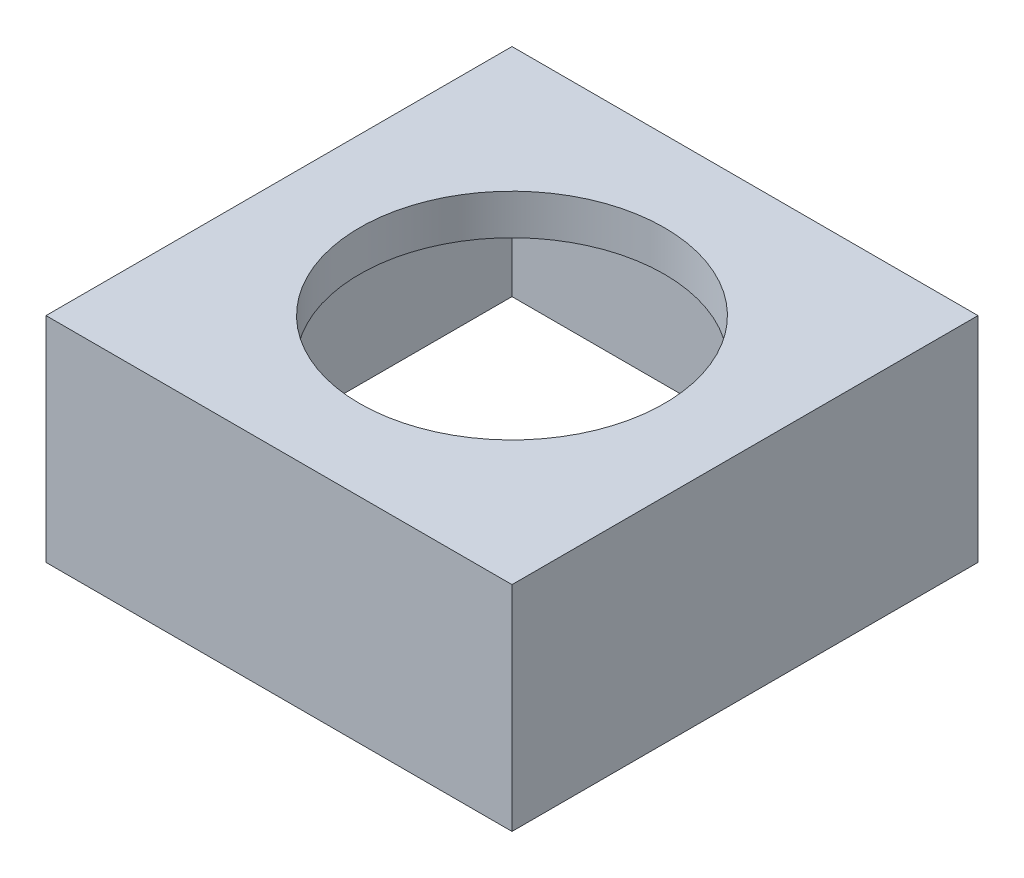
ISO-10303-21;
HEADER;
FILE_DESCRIPTION(('STEP AP214'),'2;1');
FILE_NAME('part.step','',(''),(''),'','','');
FILE_SCHEMA(('AUTOMOTIVE_DESIGN { 1 0 10303 214 1 1 1 1 }'));
ENDSEC;
DATA;
#1=APPLICATION_CONTEXT('core data for automotive mechanical design processes');
#2=APPLICATION_PROTOCOL_DEFINITION('international standard','automotive_design',2000,#1);
#3=PRODUCT_CONTEXT('',#1,'mechanical');
#4=PRODUCT('Part','Part','',(#3));
#5=PRODUCT_RELATED_PRODUCT_CATEGORY('part','',(#4));
#6=PRODUCT_DEFINITION_FORMATION('','',#4);
#7=PRODUCT_DEFINITION_CONTEXT('part definition',#1,'design');
#8=PRODUCT_DEFINITION('design','',#6,#7);
#9=PRODUCT_DEFINITION_SHAPE('','',#8);
#10=(LENGTH_UNIT() NAMED_UNIT(*) SI_UNIT(.MILLI.,.METRE.));
#11=(NAMED_UNIT(*) PLANE_ANGLE_UNIT() SI_UNIT($,.RADIAN.));
#12=(NAMED_UNIT(*) SI_UNIT($,.STERADIAN.) SOLID_ANGLE_UNIT());
#13=UNCERTAINTY_MEASURE_WITH_UNIT(LENGTH_MEASURE(1.E-05),#10,'distance_accuracy_value','');
#14=(GEOMETRIC_REPRESENTATION_CONTEXT(3) GLOBAL_UNCERTAINTY_ASSIGNED_CONTEXT((#13)) GLOBAL_UNIT_ASSIGNED_CONTEXT((#10,
#11,#12)) REPRESENTATION_CONTEXT('',''));
#15=CARTESIAN_POINT('',(0.,0.,0.));
#16=DIRECTION('',(0.,0.,1.));
#17=DIRECTION('',(1.,0.,0.));
#18=AXIS2_PLACEMENT_3D('',#15,#16,#17);
#19=CARTESIAN_POINT('',(0.,225.,0.));
#20=DIRECTION('',(0.,1.,0.));
#21=DIRECTION('',(0.,0.,1.));
#22=AXIS2_PLACEMENT_3D('',#19,#20,#21);
#23=PLANE('',#22);
#24=DIRECTION('',(0.,0.,-1.));
#25=VECTOR('',#24,1.);
#26=CARTESIAN_POINT('',(245.5,225.,245.5));
#27=LINE('',#26,#25);
#28=CARTESIAN_POINT('',(245.5,225.,245.5));
#29=VERTEX_POINT('',#28);
#30=CARTESIAN_POINT('',(245.5,225.,-245.5));
#31=VERTEX_POINT('',#30);
#32=EDGE_CURVE('E155',#29,#31,#27,.T.);
#33=ORIENTED_EDGE('',*,*,#32,.F.);
#34=DIRECTION('',(1.,0.,0.));
#35=VECTOR('',#34,1.);
#36=CARTESIAN_POINT('',(-245.5,225.,245.5));
#37=LINE('',#36,#35);
#38=CARTESIAN_POINT('',(-245.5,225.,245.5));
#39=VERTEX_POINT('',#38);
#40=EDGE_CURVE('E168',#39,#29,#37,.T.);
#41=ORIENTED_EDGE('',*,*,#40,.F.);
#42=DIRECTION('',(0.,0.,1.));
#43=VECTOR('',#42,1.);
#44=CARTESIAN_POINT('',(-245.5,225.,245.5));
#45=LINE('',#44,#43);
#46=CARTESIAN_POINT('',(-245.5,225.,-245.5));
#47=VERTEX_POINT('',#46);
#48=EDGE_CURVE('E164',#47,#39,#45,.T.);
#49=ORIENTED_EDGE('',*,*,#48,.F.);
#50=DIRECTION('',(-1.,0.,0.));
#51=VECTOR('',#50,1.);
#52=CARTESIAN_POINT('',(-245.5,225.,-245.5));
#53=LINE('',#52,#51);
#54=EDGE_CURVE('E159',#31,#47,#53,.T.);
#55=ORIENTED_EDGE('',*,*,#54,.F.);
#56=EDGE_LOOP('',(#33,#41,#49,#55));
#57=FACE_BOUND('',#56,.T.);
#58=CARTESIAN_POINT('',(0.,225.,0.));
#59=DIRECTION('',(0.,1.,0.));
#60=DIRECTION('',(0.,0.,1.));
#61=AXIS2_PLACEMENT_3D('',#58,#59,#60);
#62=CIRCLE('',#61,166.);
#63=CARTESIAN_POINT('',(0.,225.,166.));
#64=VERTEX_POINT('',#63);
#65=EDGE_CURVE('E12',#64,#64,#62,.F.);
#66=ORIENTED_EDGE('',*,*,#65,.F.);
#67=EDGE_LOOP('',(#66));
#68=FACE_BOUND('',#67,.T.);
#69=ADVANCED_FACE('F51',(#57,#68),#23,.F.);
#70=CARTESIAN_POINT('',(0.,0.,0.));
#71=DIRECTION('',(0.,-1.,0.));
#72=DIRECTION('',(0.,0.,-1.));
#73=AXIS2_PLACEMENT_3D('',#70,#71,#72);
#74=PLANE('',#73);
#75=DIRECTION('',(0.,0.,-1.));
#76=VECTOR('',#75,1.);
#77=CARTESIAN_POINT('',(248.5,0.,248.5));
#78=LINE('',#77,#76);
#79=CARTESIAN_POINT('',(248.5,0.,248.5));
#80=VERTEX_POINT('',#79);
#81=CARTESIAN_POINT('',(248.5,0.,-248.5));
#82=VERTEX_POINT('',#81);
#83=EDGE_CURVE('E197',#80,#82,#78,.T.);
#84=ORIENTED_EDGE('',*,*,#83,.F.);
#85=DIRECTION('',(1.,0.,0.));
#86=VECTOR('',#85,1.);
#87=CARTESIAN_POINT('',(-248.5,0.,248.5));
#88=LINE('',#87,#86);
#89=CARTESIAN_POINT('',(-248.5,0.,248.5));
#90=VERTEX_POINT('',#89);
#91=EDGE_CURVE('E75',#90,#80,#88,.T.);
#92=ORIENTED_EDGE('',*,*,#91,.F.);
#93=DIRECTION('',(0.,0.,1.));
#94=VECTOR('',#93,1.);
#95=CARTESIAN_POINT('',(-248.5,0.,248.5));
#96=LINE('',#95,#94);
#97=CARTESIAN_POINT('',(-248.5,0.,-248.5));
#98=VERTEX_POINT('',#97);
#99=EDGE_CURVE('E203',#98,#90,#96,.T.);
#100=ORIENTED_EDGE('',*,*,#99,.F.);
#101=DIRECTION('',(-1.,0.,0.));
#102=VECTOR('',#101,1.);
#103=CARTESIAN_POINT('',(-248.5,0.,-248.5));
#104=LINE('',#103,#102);
#105=EDGE_CURVE('E200',#82,#98,#104,.T.);
#106=ORIENTED_EDGE('',*,*,#105,.F.);
#107=EDGE_LOOP('',(#84,#92,#100,#106));
#108=FACE_BOUND('',#107,.T.);
#109=DIRECTION('',(1.,0.,0.));
#110=VECTOR('',#109,1.);
#111=CARTESIAN_POINT('',(-245.5,0.,245.5));
#112=LINE('',#111,#110);
#113=CARTESIAN_POINT('',(-245.5,0.,245.5));
#114=VERTEX_POINT('',#113);
#115=CARTESIAN_POINT('',(245.5,0.,245.5));
#116=VERTEX_POINT('',#115);
#117=EDGE_CURVE('E160',#114,#116,#112,.T.);
#118=ORIENTED_EDGE('',*,*,#117,.T.);
#119=DIRECTION('',(0.,0.,-1.));
#120=VECTOR('',#119,1.);
#121=CARTESIAN_POINT('',(245.5,0.,245.5));
#122=LINE('',#121,#120);
#123=CARTESIAN_POINT('',(245.5,0.,-245.5));
#124=VERTEX_POINT('',#123);
#125=EDGE_CURVE('E67',#116,#124,#122,.T.);
#126=ORIENTED_EDGE('',*,*,#125,.T.);
#127=DIRECTION('',(-1.,0.,0.));
#128=VECTOR('',#127,1.);
#129=CARTESIAN_POINT('',(-245.5,0.,-245.5));
#130=LINE('',#129,#128);
#131=CARTESIAN_POINT('',(-245.5,0.,-245.5));
#132=VERTEX_POINT('',#131);
#133=EDGE_CURVE('E175',#124,#132,#130,.T.);
#134=ORIENTED_EDGE('',*,*,#133,.T.);
#135=DIRECTION('',(0.,0.,1.));
#136=VECTOR('',#135,1.);
#137=CARTESIAN_POINT('',(-245.5,0.,245.5));
#138=LINE('',#137,#136);
#139=EDGE_CURVE('E179',#132,#114,#138,.T.);
#140=ORIENTED_EDGE('',*,*,#139,.T.);
#141=EDGE_LOOP('',(#118,#126,#134,#140));
#142=FACE_BOUND('',#141,.T.);
#143=ADVANCED_FACE('F217',(#108,#142),#74,.T.);
#144=CARTESIAN_POINT('',(248.5,225.,248.5));
#145=DIRECTION('',(-1.,0.,0.));
#146=DIRECTION('',(0.,0.,1.));
#147=AXIS2_PLACEMENT_3D('',#144,#145,#146);
#148=PLANE('',#147);
#149=ORIENTED_EDGE('',*,*,#83,.T.);
#150=DIRECTION('',(0.,-1.,0.));
#151=VECTOR('',#150,1.);
#152=CARTESIAN_POINT('',(248.5,225.,-248.5));
#153=LINE('',#152,#151);
#154=CARTESIAN_POINT('',(248.5,228.,-248.5));
#155=VERTEX_POINT('',#154);
#156=EDGE_CURVE('E60',#155,#82,#153,.T.);
#157=ORIENTED_EDGE('',*,*,#156,.F.);
#158=DIRECTION('',(0.,0.,-1.));
#159=VECTOR('',#158,1.);
#160=CARTESIAN_POINT('',(248.5,228.,248.5));
#161=LINE('',#160,#159);
#162=CARTESIAN_POINT('',(248.5,228.,248.5));
#163=VERTEX_POINT('',#162);
#164=EDGE_CURVE('E130',#163,#155,#161,.T.);
#165=ORIENTED_EDGE('',*,*,#164,.F.);
#166=DIRECTION('',(0.,-1.,0.));
#167=VECTOR('',#166,1.);
#168=CARTESIAN_POINT('',(248.5,225.,248.5));
#169=LINE('',#168,#167);
#170=EDGE_CURVE('E118',#163,#80,#169,.T.);
#171=ORIENTED_EDGE('',*,*,#170,.T.);
#172=EDGE_LOOP('',(#149,#157,#165,#171));
#173=FACE_BOUND('',#172,.T.);
#174=ADVANCED_FACE('F53',(#173),#148,.F.);
#175=CARTESIAN_POINT('',(-248.5,225.,-248.5));
#176=DIRECTION('',(0.,0.,1.));
#177=DIRECTION('',(1.,0.,0.));
#178=AXIS2_PLACEMENT_3D('',#175,#176,#177);
#179=PLANE('',#178);
#180=ORIENTED_EDGE('',*,*,#105,.T.);
#181=DIRECTION('',(0.,-1.,0.));
#182=VECTOR('',#181,1.);
#183=CARTESIAN_POINT('',(-248.5,225.,-248.5));
#184=LINE('',#183,#182);
#185=CARTESIAN_POINT('',(-248.5,228.,-248.5));
#186=VERTEX_POINT('',#185);
#187=EDGE_CURVE('E210',#186,#98,#184,.T.);
#188=ORIENTED_EDGE('',*,*,#187,.F.);
#189=DIRECTION('',(-1.,0.,0.));
#190=VECTOR('',#189,1.);
#191=CARTESIAN_POINT('',(248.5,228.,-248.5));
#192=LINE('',#191,#190);
#193=EDGE_CURVE('E136',#155,#186,#192,.T.);
#194=ORIENTED_EDGE('',*,*,#193,.F.);
#195=ORIENTED_EDGE('',*,*,#156,.T.);
#196=EDGE_LOOP('',(#180,#188,#194,#195));
#197=FACE_BOUND('',#196,.T.);
#198=ADVANCED_FACE('F215',(#197),#179,.F.);
#199=CARTESIAN_POINT('',(-248.5,225.,248.5));
#200=DIRECTION('',(1.,0.,0.));
#201=DIRECTION('',(0.,0.,-1.));
#202=AXIS2_PLACEMENT_3D('',#199,#200,#201);
#203=PLANE('',#202);
#204=ORIENTED_EDGE('',*,*,#99,.T.);
#205=DIRECTION('',(0.,-1.,0.));
#206=VECTOR('',#205,1.);
#207=CARTESIAN_POINT('',(-248.5,225.,248.5));
#208=LINE('',#207,#206);
#209=CARTESIAN_POINT('',(-248.5,228.,248.5));
#210=VERTEX_POINT('',#209);
#211=EDGE_CURVE('E127',#210,#90,#208,.T.);
#212=ORIENTED_EDGE('',*,*,#211,.F.);
#213=DIRECTION('',(0.,0.,1.));
#214=VECTOR('',#213,1.);
#215=CARTESIAN_POINT('',(-248.5,228.,-248.5));
#216=LINE('',#215,#214);
#217=EDGE_CURVE('E141',#186,#210,#216,.T.);
#218=ORIENTED_EDGE('',*,*,#217,.F.);
#219=ORIENTED_EDGE('',*,*,#187,.T.);
#220=EDGE_LOOP('',(#204,#212,#218,#219));
#221=FACE_BOUND('',#220,.T.);
#222=ADVANCED_FACE('F221',(#221),#203,.F.);
#223=CARTESIAN_POINT('',(-248.5,225.,248.5));
#224=DIRECTION('',(0.,0.,-1.));
#225=DIRECTION('',(-1.,0.,0.));
#226=AXIS2_PLACEMENT_3D('',#223,#224,#225);
#227=PLANE('',#226);
#228=ORIENTED_EDGE('',*,*,#91,.T.);
#229=ORIENTED_EDGE('',*,*,#170,.F.);
#230=DIRECTION('',(1.,0.,0.));
#231=VECTOR('',#230,1.);
#232=CARTESIAN_POINT('',(-248.5,228.,248.5));
#233=LINE('',#232,#231);
#234=EDGE_CURVE('E122',#210,#163,#233,.T.);
#235=ORIENTED_EDGE('',*,*,#234,.F.);
#236=ORIENTED_EDGE('',*,*,#211,.T.);
#237=EDGE_LOOP('',(#228,#229,#235,#236));
#238=FACE_BOUND('',#237,.T.);
#239=ADVANCED_FACE('F120',(#238),#227,.F.);
#240=CARTESIAN_POINT('',(245.5,225.,245.5));
#241=DIRECTION('',(-1.,0.,0.));
#242=DIRECTION('',(0.,0.,1.));
#243=AXIS2_PLACEMENT_3D('',#240,#241,#242);
#244=PLANE('',#243);
#245=ORIENTED_EDGE('',*,*,#125,.F.);
#246=DIRECTION('',(0.,-1.,0.));
#247=VECTOR('',#246,1.);
#248=CARTESIAN_POINT('',(245.5,225.,245.5));
#249=LINE('',#248,#247);
#250=EDGE_CURVE('E172',#29,#116,#249,.T.);
#251=ORIENTED_EDGE('',*,*,#250,.F.);
#252=ORIENTED_EDGE('',*,*,#32,.T.);
#253=DIRECTION('',(0.,-1.,0.));
#254=VECTOR('',#253,1.);
#255=CARTESIAN_POINT('',(245.5,225.,-245.5));
#256=LINE('',#255,#254);
#257=EDGE_CURVE('E194',#31,#124,#256,.T.);
#258=ORIENTED_EDGE('',*,*,#257,.T.);
#259=EDGE_LOOP('',(#245,#251,#252,#258));
#260=FACE_BOUND('',#259,.T.);
#261=ADVANCED_FACE('F228',(#260),#244,.T.);
#262=CARTESIAN_POINT('',(-245.5,225.,-245.5));
#263=DIRECTION('',(0.,0.,1.));
#264=DIRECTION('',(1.,0.,0.));
#265=AXIS2_PLACEMENT_3D('',#262,#263,#264);
#266=PLANE('',#265);
#267=ORIENTED_EDGE('',*,*,#133,.F.);
#268=ORIENTED_EDGE('',*,*,#257,.F.);
#269=ORIENTED_EDGE('',*,*,#54,.T.);
#270=DIRECTION('',(0.,-1.,0.));
#271=VECTOR('',#270,1.);
#272=CARTESIAN_POINT('',(-245.5,225.,-245.5));
#273=LINE('',#272,#271);
#274=EDGE_CURVE('E191',#47,#132,#273,.T.);
#275=ORIENTED_EDGE('',*,*,#274,.T.);
#276=EDGE_LOOP('',(#267,#268,#269,#275));
#277=FACE_BOUND('',#276,.T.);
#278=ADVANCED_FACE('F250',(#277),#266,.T.);
#279=CARTESIAN_POINT('',(-245.5,225.,245.5));
#280=DIRECTION('',(1.,0.,0.));
#281=DIRECTION('',(0.,0.,-1.));
#282=AXIS2_PLACEMENT_3D('',#279,#280,#281);
#283=PLANE('',#282);
#284=ORIENTED_EDGE('',*,*,#139,.F.);
#285=ORIENTED_EDGE('',*,*,#274,.F.);
#286=ORIENTED_EDGE('',*,*,#48,.T.);
#287=DIRECTION('',(0.,-1.,0.));
#288=VECTOR('',#287,1.);
#289=CARTESIAN_POINT('',(-245.5,225.,245.5));
#290=LINE('',#289,#288);
#291=EDGE_CURVE('E188',#39,#114,#290,.T.);
#292=ORIENTED_EDGE('',*,*,#291,.T.);
#293=EDGE_LOOP('',(#284,#285,#286,#292));
#294=FACE_BOUND('',#293,.T.);
#295=ADVANCED_FACE('F246',(#294),#283,.T.);
#296=CARTESIAN_POINT('',(-245.5,225.,245.5));
#297=DIRECTION('',(0.,0.,-1.));
#298=DIRECTION('',(-1.,0.,0.));
#299=AXIS2_PLACEMENT_3D('',#296,#297,#298);
#300=PLANE('',#299);
#301=ORIENTED_EDGE('',*,*,#117,.F.);
#302=ORIENTED_EDGE('',*,*,#291,.F.);
#303=ORIENTED_EDGE('',*,*,#40,.T.);
#304=ORIENTED_EDGE('',*,*,#250,.T.);
#305=EDGE_LOOP('',(#301,#302,#303,#304));
#306=FACE_BOUND('',#305,.T.);
#307=ADVANCED_FACE('F243',(#306),#300,.T.);
#308=CARTESIAN_POINT('',(0.,228.,0.));
#309=DIRECTION('',(0.,1.,0.));
#310=DIRECTION('',(0.,0.,1.));
#311=AXIS2_PLACEMENT_3D('',#308,#309,#310);
#312=PLANE('',#311);
#313=CARTESIAN_POINT('',(0.,228.,0.));
#314=DIRECTION('',(0.,1.,0.));
#315=DIRECTION('',(0.,0.,1.));
#316=AXIS2_PLACEMENT_3D('',#313,#314,#315);
#317=CIRCLE('',#316,162.5);
#318=CARTESIAN_POINT('',(0.,228.,162.5));
#319=VERTEX_POINT('',#318);
#320=EDGE_CURVE('E143',#319,#319,#317,.T.);
#321=ORIENTED_EDGE('',*,*,#320,.F.);
#322=EDGE_LOOP('',(#321));
#323=FACE_BOUND('',#322,.T.);
#324=ORIENTED_EDGE('',*,*,#234,.T.);
#325=ORIENTED_EDGE('',*,*,#164,.T.);
#326=ORIENTED_EDGE('',*,*,#193,.T.);
#327=ORIENTED_EDGE('',*,*,#217,.T.);
#328=EDGE_LOOP('',(#324,#325,#326,#327));
#329=FACE_BOUND('',#328,.T.);
#330=ADVANCED_FACE('F139',(#323,#329),#312,.T.);
#331=CARTESIAN_POINT('',(0.,-0.001000000000001,0.));
#332=DIRECTION('',(0.,1.,0.));
#333=DIRECTION('',(0.,0.,1.));
#334=AXIS2_PLACEMENT_3D('',#331,#332,#333);
#335=CYLINDRICAL_SURFACE('',#334,162.5);
#336=ORIENTED_EDGE('',*,*,#320,.T.);
#337=EDGE_LOOP('',(#336));
#338=FACE_BOUND('',#337,.T.);
#339=CARTESIAN_POINT('',(0.,185.,0.));
#340=DIRECTION('',(0.,-1.,0.));
#341=DIRECTION('',(0.,0.,-1.));
#342=AXIS2_PLACEMENT_3D('',#339,#340,#341);
#343=CIRCLE('',#342,162.5);
#344=CARTESIAN_POINT('',(0.,185.,-162.5));
#345=VERTEX_POINT('',#344);
#346=EDGE_CURVE('E329',#345,#345,#343,.T.);
#347=ORIENTED_EDGE('',*,*,#346,.T.);
#348=EDGE_LOOP('',(#347));
#349=FACE_BOUND('',#348,.T.);
#350=ADVANCED_FACE('F282',(#338,#349),#335,.F.);
#351=CARTESIAN_POINT('',(0.,185.,0.));
#352=DIRECTION('',(0.,-1.,0.));
#353=DIRECTION('',(0.,0.,-1.));
#354=AXIS2_PLACEMENT_3D('',#351,#352,#353);
#355=PLANE('',#354);
#356=CARTESIAN_POINT('',(0.,185.,0.));
#357=DIRECTION('',(0.,-1.,0.));
#358=DIRECTION('',(0.,0.,-1.));
#359=AXIS2_PLACEMENT_3D('',#356,#357,#358);
#360=CIRCLE('',#359,166.);
#361=CARTESIAN_POINT('',(0.,185.,-166.));
#362=VERTEX_POINT('',#361);
#363=EDGE_CURVE('E147',#362,#362,#360,.T.);
#364=ORIENTED_EDGE('',*,*,#363,.T.);
#365=EDGE_LOOP('',(#364));
#366=FACE_BOUND('',#365,.T.);
#367=ORIENTED_EDGE('',*,*,#346,.F.);
#368=EDGE_LOOP('',(#367));
#369=FACE_BOUND('',#368,.T.);
#370=ADVANCED_FACE('F296',(#366,#369),#355,.T.);
#371=CARTESIAN_POINT('',(0.,185.,0.));
#372=DIRECTION('',(0.,1.,0.));
#373=DIRECTION('',(0.,0.,1.));
#374=AXIS2_PLACEMENT_3D('',#371,#372,#373);
#375=CYLINDRICAL_SURFACE('',#374,166.);
#376=ORIENTED_EDGE('',*,*,#363,.F.);
#377=EDGE_LOOP('',(#376));
#378=FACE_BOUND('',#377,.T.);
#379=ORIENTED_EDGE('',*,*,#65,.T.);
#380=EDGE_LOOP('',(#379));
#381=FACE_BOUND('',#380,.T.);
#382=ADVANCED_FACE('F309',(#378,#381),#375,.T.);
#383=CLOSED_SHELL('',(#69,#143,#174,#198,#222,#239,#261,#278,#295,#307,#330,#350,#370,#382));
#384=MANIFOLD_SOLID_BREP('B2',#383);
#385=ADVANCED_BREP_SHAPE_REPRESENTATION('',(#18,#384),#14);
#386=SHAPE_DEFINITION_REPRESENTATION(#9,#385);
ENDSEC;
END-ISO-10303-21;
